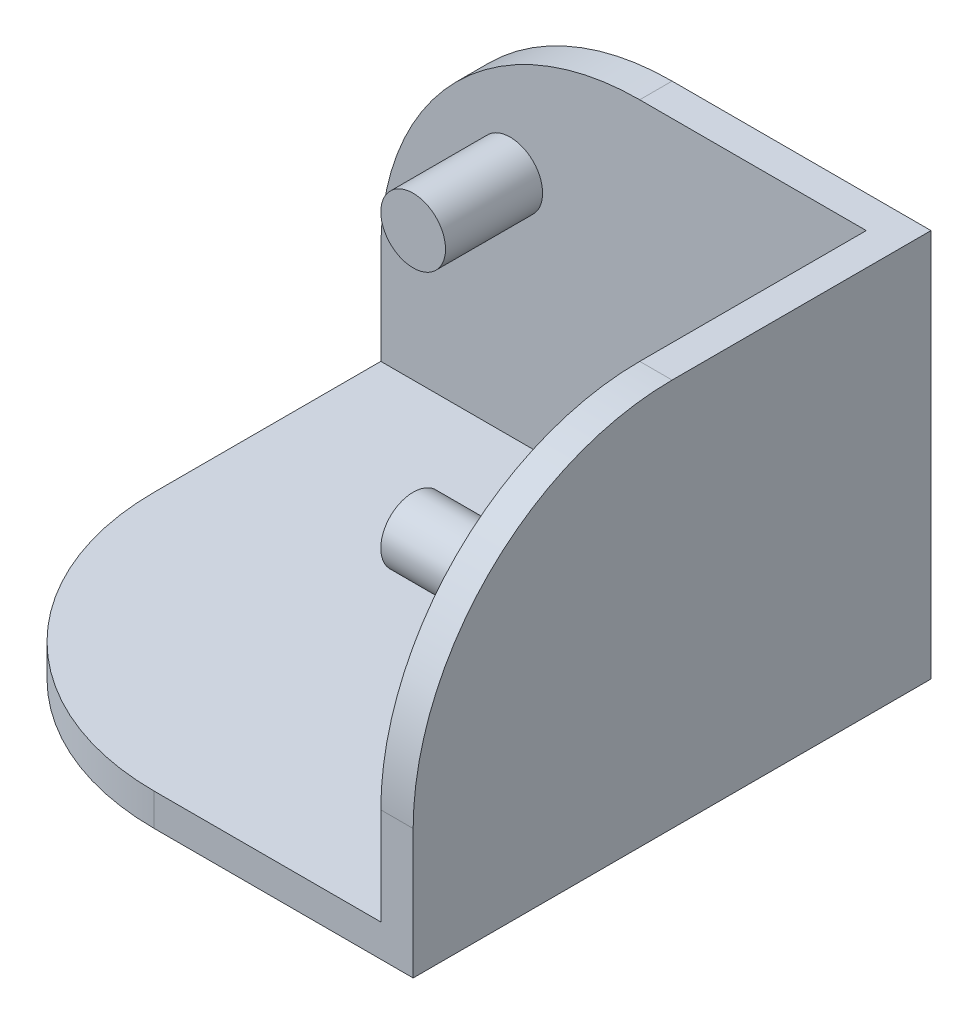
ISO-10303-21;
HEADER;
FILE_DESCRIPTION(('STEP AP214'),'2;1');
FILE_NAME('part.step','',(''),(''),'','','');
FILE_SCHEMA(('AUTOMOTIVE_DESIGN { 1 0 10303 214 1 1 1 1 }'));
ENDSEC;
DATA;
#1=APPLICATION_CONTEXT('core data for automotive mechanical design processes');
#2=APPLICATION_PROTOCOL_DEFINITION('international standard','automotive_design',2000,#1);
#3=PRODUCT_CONTEXT('',#1,'mechanical');
#4=PRODUCT('Part','Part','',(#3));
#5=PRODUCT_RELATED_PRODUCT_CATEGORY('part','',(#4));
#6=PRODUCT_DEFINITION_FORMATION('','',#4);
#7=PRODUCT_DEFINITION_CONTEXT('part definition',#1,'design');
#8=PRODUCT_DEFINITION('design','',#6,#7);
#9=PRODUCT_DEFINITION_SHAPE('','',#8);
#10=(LENGTH_UNIT() NAMED_UNIT(*) SI_UNIT(.MILLI.,.METRE.));
#11=(NAMED_UNIT(*) PLANE_ANGLE_UNIT() SI_UNIT($,.RADIAN.));
#12=(NAMED_UNIT(*) SI_UNIT($,.STERADIAN.) SOLID_ANGLE_UNIT());
#13=UNCERTAINTY_MEASURE_WITH_UNIT(LENGTH_MEASURE(1.E-05),#10,'distance_accuracy_value','');
#14=(GEOMETRIC_REPRESENTATION_CONTEXT(3) GLOBAL_UNCERTAINTY_ASSIGNED_CONTEXT((#13)) GLOBAL_UNIT_ASSIGNED_CONTEXT((#10,
#11,#12)) REPRESENTATION_CONTEXT('',''));
#15=CARTESIAN_POINT('',(0.,0.,0.));
#16=DIRECTION('',(0.,0.,1.));
#17=DIRECTION('',(1.,0.,0.));
#18=AXIS2_PLACEMENT_3D('',#15,#16,#17);
#19=CARTESIAN_POINT('',(40.,5.,-40.));
#20=DIRECTION('',(-1.,0.,0.));
#21=DIRECTION('',(0.,0.,1.));
#22=AXIS2_PLACEMENT_3D('',#19,#20,#21);
#23=PLANE('',#22);
#24=DIRECTION('',(0.,0.,1.));
#25=VECTOR('',#24,1.);
#26=CARTESIAN_POINT('',(40.,60.,-40.));
#27=LINE('',#26,#25);
#28=CARTESIAN_POINT('',(40.,60.,-40.));
#29=VERTEX_POINT('',#28);
#30=CARTESIAN_POINT('',(40.,60.,0.));
#31=VERTEX_POINT('',#30);
#32=EDGE_CURVE('E120',#29,#31,#27,.T.);
#33=ORIENTED_EDGE('',*,*,#32,.T.);
#34=CARTESIAN_POINT('',(40.,20.,0.));
#35=DIRECTION('',(-1.,0.,0.));
#36=DIRECTION('',(0.,0.,1.));
#37=AXIS2_PLACEMENT_3D('',#34,#35,#36);
#38=CIRCLE('',#37,40.);
#39=CARTESIAN_POINT('',(40.,20.,40.));
#40=VERTEX_POINT('',#39);
#41=EDGE_CURVE('E189',#31,#40,#38,.F.);
#42=ORIENTED_EDGE('',*,*,#41,.T.);
#43=DIRECTION('',(0.,-1.,0.));
#44=VECTOR('',#43,1.);
#45=CARTESIAN_POINT('',(40.,5.,40.));
#46=LINE('',#45,#44);
#47=CARTESIAN_POINT('',(40.,0.,40.));
#48=VERTEX_POINT('',#47);
#49=EDGE_CURVE('E157',#40,#48,#46,.T.);
#50=ORIENTED_EDGE('',*,*,#49,.T.);
#51=DIRECTION('',(0.,0.,-1.));
#52=VECTOR('',#51,1.);
#53=CARTESIAN_POINT('',(40.,0.,-40.));
#54=LINE('',#53,#52);
#55=CARTESIAN_POINT('',(40.,0.,-40.));
#56=VERTEX_POINT('',#55);
#57=EDGE_CURVE('E125',#48,#56,#54,.T.);
#58=ORIENTED_EDGE('',*,*,#57,.T.);
#59=DIRECTION('',(0.,-1.,0.));
#60=VECTOR('',#59,1.);
#61=CARTESIAN_POINT('',(40.,5.,-40.));
#62=LINE('',#61,#60);
#63=EDGE_CURVE('E116',#29,#56,#62,.T.);
#64=ORIENTED_EDGE('',*,*,#63,.F.);
#65=EDGE_LOOP('',(#33,#42,#50,#58,#64));
#66=FACE_BOUND('',#65,.T.);
#67=ADVANCED_FACE('F33',(#66),#23,.F.);
#68=CARTESIAN_POINT('',(-40.,5.,-40.));
#69=DIRECTION('',(0.,0.,1.));
#70=DIRECTION('',(1.,0.,0.));
#71=AXIS2_PLACEMENT_3D('',#68,#69,#70);
#72=PLANE('',#71);
#73=DIRECTION('',(0.,-1.,0.));
#74=VECTOR('',#73,1.);
#75=CARTESIAN_POINT('',(-40.,5.,-40.));
#76=LINE('',#75,#74);
#77=CARTESIAN_POINT('',(-40.,20.,-40.));
#78=VERTEX_POINT('',#77);
#79=CARTESIAN_POINT('',(-40.,0.,-40.));
#80=VERTEX_POINT('',#79);
#81=EDGE_CURVE('E127',#78,#80,#76,.T.);
#82=ORIENTED_EDGE('',*,*,#81,.F.);
#83=CARTESIAN_POINT('',(0.,20.,-40.));
#84=DIRECTION('',(0.,0.,1.));
#85=DIRECTION('',(1.,0.,0.));
#86=AXIS2_PLACEMENT_3D('',#83,#84,#85);
#87=CIRCLE('',#86,40.);
#88=CARTESIAN_POINT('',(0.,60.,-40.));
#89=VERTEX_POINT('',#88);
#90=EDGE_CURVE('E118',#78,#89,#87,.F.);
#91=ORIENTED_EDGE('',*,*,#90,.T.);
#92=DIRECTION('',(1.,0.,0.));
#93=VECTOR('',#92,1.);
#94=CARTESIAN_POINT('',(-40.,60.,-40.));
#95=LINE('',#94,#93);
#96=EDGE_CURVE('E111',#89,#29,#95,.T.);
#97=ORIENTED_EDGE('',*,*,#96,.T.);
#98=ORIENTED_EDGE('',*,*,#63,.T.);
#99=DIRECTION('',(-1.,0.,0.));
#100=VECTOR('',#99,1.);
#101=CARTESIAN_POINT('',(-40.,0.,-40.));
#102=LINE('',#101,#100);
#103=EDGE_CURVE('E159',#56,#80,#102,.T.);
#104=ORIENTED_EDGE('',*,*,#103,.T.);
#105=EDGE_LOOP('',(#82,#91,#97,#98,#104));
#106=FACE_BOUND('',#105,.T.);
#107=ADVANCED_FACE('F114',(#106),#72,.F.);
#108=CARTESIAN_POINT('',(-40.,5.,-40.));
#109=DIRECTION('',(1.,0.,0.));
#110=DIRECTION('',(0.,0.,-1.));
#111=AXIS2_PLACEMENT_3D('',#108,#109,#110);
#112=PLANE('',#111);
#113=DIRECTION('',(0.,0.,1.));
#114=VECTOR('',#113,1.);
#115=CARTESIAN_POINT('',(-40.,0.,-40.));
#116=LINE('',#115,#114);
#117=CARTESIAN_POINT('',(-40.,0.,0.));
#118=VERTEX_POINT('',#117);
#119=EDGE_CURVE('E161',#80,#118,#116,.T.);
#120=ORIENTED_EDGE('',*,*,#119,.T.);
#121=DIRECTION('',(0.,-1.,0.));
#122=VECTOR('',#121,1.);
#123=CARTESIAN_POINT('',(-40.,5.,0.));
#124=LINE('',#123,#122);
#125=CARTESIAN_POINT('',(-40.,5.,0.));
#126=VERTEX_POINT('',#125);
#127=EDGE_CURVE('E178',#118,#126,#124,.F.);
#128=ORIENTED_EDGE('',*,*,#127,.T.);
#129=DIRECTION('',(0.,0.,1.));
#130=VECTOR('',#129,1.);
#131=CARTESIAN_POINT('',(-40.,5.,-40.));
#132=LINE('',#131,#130);
#133=CARTESIAN_POINT('',(-40.,5.,-35.));
#134=VERTEX_POINT('',#133);
#135=EDGE_CURVE('E151',#134,#126,#132,.T.);
#136=ORIENTED_EDGE('',*,*,#135,.F.);
#137=DIRECTION('',(0.,-1.,0.));
#138=VECTOR('',#137,1.);
#139=CARTESIAN_POINT('',(-40.,60.,-35.));
#140=LINE('',#139,#138);
#141=CARTESIAN_POINT('',(-40.,20.,-35.));
#142=VERTEX_POINT('',#141);
#143=EDGE_CURVE('E146',#142,#134,#140,.T.);
#144=ORIENTED_EDGE('',*,*,#143,.F.);
#145=DIRECTION('',(0.,0.,-1.));
#146=VECTOR('',#145,1.);
#147=CARTESIAN_POINT('',(-40.,20.,-40.));
#148=LINE('',#147,#146);
#149=EDGE_CURVE('E175',#142,#78,#148,.T.);
#150=ORIENTED_EDGE('',*,*,#149,.T.);
#151=ORIENTED_EDGE('',*,*,#81,.T.);
#152=EDGE_LOOP('',(#120,#128,#136,#144,#150,#151));
#153=FACE_BOUND('',#152,.T.);
#154=ADVANCED_FACE('F214',(#153),#112,.F.);
#155=CARTESIAN_POINT('',(-40.,5.,40.));
#156=DIRECTION('',(0.,0.,-1.));
#157=DIRECTION('',(-1.,0.,0.));
#158=AXIS2_PLACEMENT_3D('',#155,#156,#157);
#159=PLANE('',#158);
#160=DIRECTION('',(1.,0.,0.));
#161=VECTOR('',#160,1.);
#162=CARTESIAN_POINT('',(-40.,5.,40.));
#163=LINE('',#162,#161);
#164=CARTESIAN_POINT('',(0.,5.,40.));
#165=VERTEX_POINT('',#164);
#166=CARTESIAN_POINT('',(35.,5.,40.));
#167=VERTEX_POINT('',#166);
#168=EDGE_CURVE('E154',#165,#167,#163,.T.);
#169=ORIENTED_EDGE('',*,*,#168,.F.);
#170=DIRECTION('',(0.,-1.,0.));
#171=VECTOR('',#170,1.);
#172=CARTESIAN_POINT('',(0.,5.,40.));
#173=LINE('',#172,#171);
#174=CARTESIAN_POINT('',(0.,0.,40.));
#175=VERTEX_POINT('',#174);
#176=EDGE_CURVE('E170',#165,#175,#173,.T.);
#177=ORIENTED_EDGE('',*,*,#176,.T.);
#178=DIRECTION('',(1.,0.,0.));
#179=VECTOR('',#178,1.);
#180=CARTESIAN_POINT('',(-40.,0.,40.));
#181=LINE('',#180,#179);
#182=EDGE_CURVE('E155',#175,#48,#181,.T.);
#183=ORIENTED_EDGE('',*,*,#182,.T.);
#184=ORIENTED_EDGE('',*,*,#49,.F.);
#185=DIRECTION('',(-1.,0.,0.));
#186=VECTOR('',#185,1.);
#187=CARTESIAN_POINT('',(-40.,20.,40.));
#188=LINE('',#187,#186);
#189=CARTESIAN_POINT('',(35.,20.,40.));
#190=VERTEX_POINT('',#189);
#191=EDGE_CURVE('E126',#40,#190,#188,.T.);
#192=ORIENTED_EDGE('',*,*,#191,.T.);
#193=DIRECTION('',(0.,-1.,0.));
#194=VECTOR('',#193,1.);
#195=CARTESIAN_POINT('',(35.,60.,40.));
#196=LINE('',#195,#194);
#197=EDGE_CURVE('E148',#190,#167,#196,.T.);
#198=ORIENTED_EDGE('',*,*,#197,.T.);
#199=EDGE_LOOP('',(#169,#177,#183,#184,#192,#198));
#200=FACE_BOUND('',#199,.T.);
#201=ADVANCED_FACE('F205',(#200),#159,.F.);
#202=CARTESIAN_POINT('',(0.,5.,0.));
#203=DIRECTION('',(0.,1.,0.));
#204=DIRECTION('',(0.,0.,1.));
#205=AXIS2_PLACEMENT_3D('',#202,#203,#204);
#206=PLANE('',#205);
#207=ORIENTED_EDGE('',*,*,#135,.T.);
#208=CARTESIAN_POINT('',(0.,5.,0.));
#209=DIRECTION('',(0.,1.,0.));
#210=DIRECTION('',(0.,0.,1.));
#211=AXIS2_PLACEMENT_3D('',#208,#209,#210);
#212=CIRCLE('',#211,40.);
#213=EDGE_CURVE('E180',#126,#165,#212,.T.);
#214=ORIENTED_EDGE('',*,*,#213,.T.);
#215=ORIENTED_EDGE('',*,*,#168,.T.);
#216=DIRECTION('',(0.,0.,1.));
#217=VECTOR('',#216,1.);
#218=CARTESIAN_POINT('',(35.,5.,-40.));
#219=LINE('',#218,#217);
#220=CARTESIAN_POINT('',(35.,5.,-35.));
#221=VERTEX_POINT('',#220);
#222=EDGE_CURVE('E138',#221,#167,#219,.T.);
#223=ORIENTED_EDGE('',*,*,#222,.F.);
#224=DIRECTION('',(1.,0.,0.));
#225=VECTOR('',#224,1.);
#226=CARTESIAN_POINT('',(-40.,5.,-35.));
#227=LINE('',#226,#225);
#228=EDGE_CURVE('E132',#134,#221,#227,.T.);
#229=ORIENTED_EDGE('',*,*,#228,.F.);
#230=EDGE_LOOP('',(#207,#214,#215,#223,#229));
#231=FACE_BOUND('',#230,.T.);
#232=ADVANCED_FACE('F226',(#231),#206,.T.);
#233=CARTESIAN_POINT('',(0.,0.,0.));
#234=DIRECTION('',(0.,1.,0.));
#235=DIRECTION('',(0.,0.,1.));
#236=AXIS2_PLACEMENT_3D('',#233,#234,#235);
#237=PLANE('',#236);
#238=ORIENTED_EDGE('',*,*,#182,.F.);
#239=CARTESIAN_POINT('',(0.,0.,0.));
#240=DIRECTION('',(0.,1.,0.));
#241=DIRECTION('',(0.,0.,1.));
#242=AXIS2_PLACEMENT_3D('',#239,#240,#241);
#243=CIRCLE('',#242,40.);
#244=EDGE_CURVE('E173',#175,#118,#243,.F.);
#245=ORIENTED_EDGE('',*,*,#244,.T.);
#246=ORIENTED_EDGE('',*,*,#119,.F.);
#247=ORIENTED_EDGE('',*,*,#103,.F.);
#248=ORIENTED_EDGE('',*,*,#57,.F.);
#249=EDGE_LOOP('',(#238,#245,#246,#247,#248));
#250=FACE_BOUND('',#249,.T.);
#251=ADVANCED_FACE('F199',(#250),#237,.F.);
#252=CARTESIAN_POINT('',(35.,60.,-40.));
#253=DIRECTION('',(1.,0.,0.));
#254=DIRECTION('',(0.,0.,-1.));
#255=AXIS2_PLACEMENT_3D('',#252,#253,#254);
#256=PLANE('',#255);
#257=CARTESIAN_POINT('',(35.,40.,20.));
#258=DIRECTION('',(1.,0.,0.));
#259=DIRECTION('',(0.,0.,-1.));
#260=AXIS2_PLACEMENT_3D('',#257,#258,#259);
#261=CIRCLE('',#260,5.);
#262=CARTESIAN_POINT('',(35.,40.,15.));
#263=VERTEX_POINT('',#262);
#264=EDGE_CURVE('E41',#263,#263,#261,.F.);
#265=ORIENTED_EDGE('',*,*,#264,.F.);
#266=EDGE_LOOP('',(#265));
#267=FACE_BOUND('',#266,.T.);
#268=ORIENTED_EDGE('',*,*,#197,.F.);
#269=CARTESIAN_POINT('',(35.,20.,0.));
#270=DIRECTION('',(1.,0.,0.));
#271=DIRECTION('',(0.,0.,-1.));
#272=AXIS2_PLACEMENT_3D('',#269,#270,#271);
#273=CIRCLE('',#272,40.);
#274=CARTESIAN_POINT('',(35.,60.,0.));
#275=VERTEX_POINT('',#274);
#276=EDGE_CURVE('E187',#190,#275,#273,.F.);
#277=ORIENTED_EDGE('',*,*,#276,.T.);
#278=DIRECTION('',(0.,0.,1.));
#279=VECTOR('',#278,1.);
#280=CARTESIAN_POINT('',(35.,60.,-40.));
#281=LINE('',#280,#279);
#282=CARTESIAN_POINT('',(35.,60.,-35.));
#283=VERTEX_POINT('',#282);
#284=EDGE_CURVE('E130',#283,#275,#281,.T.);
#285=ORIENTED_EDGE('',*,*,#284,.F.);
#286=DIRECTION('',(0.,-1.,0.));
#287=VECTOR('',#286,1.);
#288=CARTESIAN_POINT('',(35.,60.,-35.));
#289=LINE('',#288,#287);
#290=EDGE_CURVE('E137',#283,#221,#289,.T.);
#291=ORIENTED_EDGE('',*,*,#290,.T.);
#292=ORIENTED_EDGE('',*,*,#222,.T.);
#293=EDGE_LOOP('',(#268,#277,#285,#291,#292));
#294=FACE_BOUND('',#293,.T.);
#295=ADVANCED_FACE('F195',(#267,#294),#256,.F.);
#296=CARTESIAN_POINT('',(-40.,60.,-35.));
#297=DIRECTION('',(0.,0.,-1.));
#298=DIRECTION('',(-1.,0.,0.));
#299=AXIS2_PLACEMENT_3D('',#296,#297,#298);
#300=PLANE('',#299);
#301=CARTESIAN_POINT('',(-20.,40.,-35.));
#302=DIRECTION('',(0.,0.,-1.));
#303=DIRECTION('',(-1.,0.,0.));
#304=AXIS2_PLACEMENT_3D('',#301,#302,#303);
#305=CIRCLE('',#304,5.);
#306=CARTESIAN_POINT('',(-25.,40.,-35.));
#307=VERTEX_POINT('',#306);
#308=EDGE_CURVE('E11',#307,#307,#305,.F.);
#309=ORIENTED_EDGE('',*,*,#308,.F.);
#310=EDGE_LOOP('',(#309));
#311=FACE_BOUND('',#310,.T.);
#312=DIRECTION('',(1.,0.,0.));
#313=VECTOR('',#312,1.);
#314=CARTESIAN_POINT('',(-40.,60.,-35.));
#315=LINE('',#314,#313);
#316=CARTESIAN_POINT('',(0.,60.,-35.));
#317=VERTEX_POINT('',#316);
#318=EDGE_CURVE('E119',#317,#283,#315,.T.);
#319=ORIENTED_EDGE('',*,*,#318,.F.);
#320=CARTESIAN_POINT('',(0.,20.,-35.));
#321=DIRECTION('',(0.,0.,-1.));
#322=DIRECTION('',(-1.,0.,0.));
#323=AXIS2_PLACEMENT_3D('',#320,#321,#322);
#324=CIRCLE('',#323,40.);
#325=EDGE_CURVE('E185',#317,#142,#324,.F.);
#326=ORIENTED_EDGE('',*,*,#325,.T.);
#327=ORIENTED_EDGE('',*,*,#143,.T.);
#328=ORIENTED_EDGE('',*,*,#228,.T.);
#329=ORIENTED_EDGE('',*,*,#290,.F.);
#330=EDGE_LOOP('',(#319,#326,#327,#328,#329));
#331=FACE_BOUND('',#330,.T.);
#332=ADVANCED_FACE('F198',(#311,#331),#300,.F.);
#333=CARTESIAN_POINT('',(0.,60.,0.));
#334=DIRECTION('',(0.,-1.,0.));
#335=DIRECTION('',(-1.,0.,0.));
#336=AXIS2_PLACEMENT_3D('',#333,#334,#335);
#337=PLANE('',#336);
#338=ORIENTED_EDGE('',*,*,#96,.F.);
#339=DIRECTION('',(0.,0.,-1.));
#340=VECTOR('',#339,1.);
#341=CARTESIAN_POINT('',(0.,60.,0.));
#342=LINE('',#341,#340);
#343=EDGE_CURVE('E48',#89,#317,#342,.F.);
#344=ORIENTED_EDGE('',*,*,#343,.T.);
#345=ORIENTED_EDGE('',*,*,#318,.T.);
#346=ORIENTED_EDGE('',*,*,#284,.T.);
#347=DIRECTION('',(-1.,0.,0.));
#348=VECTOR('',#347,1.);
#349=CARTESIAN_POINT('',(0.,60.,0.));
#350=LINE('',#349,#348);
#351=EDGE_CURVE('E55',#275,#31,#350,.F.);
#352=ORIENTED_EDGE('',*,*,#351,.T.);
#353=ORIENTED_EDGE('',*,*,#32,.F.);
#354=EDGE_LOOP('',(#338,#344,#345,#346,#352,#353));
#355=FACE_BOUND('',#354,.T.);
#356=ADVANCED_FACE('F129',(#355),#337,.F.);
#357=CARTESIAN_POINT('',(0.,5.,0.));
#358=DIRECTION('',(0.,-1.,0.));
#359=DIRECTION('',(0.,0.,-1.));
#360=AXIS2_PLACEMENT_3D('',#357,#358,#359);
#361=CYLINDRICAL_SURFACE('',#360,40.);
#362=ORIENTED_EDGE('',*,*,#213,.F.);
#363=ORIENTED_EDGE('',*,*,#127,.F.);
#364=ORIENTED_EDGE('',*,*,#244,.F.);
#365=ORIENTED_EDGE('',*,*,#176,.F.);
#366=EDGE_LOOP('',(#362,#363,#364,#365));
#367=FACE_BOUND('',#366,.T.);
#368=ADVANCED_FACE('F229',(#367),#361,.T.);
#369=CARTESIAN_POINT('',(0.,20.,-40.));
#370=DIRECTION('',(0.,0.,-1.));
#371=DIRECTION('',(-1.,0.,0.));
#372=AXIS2_PLACEMENT_3D('',#369,#370,#371);
#373=CYLINDRICAL_SURFACE('',#372,40.);
#374=ORIENTED_EDGE('',*,*,#325,.F.);
#375=ORIENTED_EDGE('',*,*,#343,.F.);
#376=ORIENTED_EDGE('',*,*,#90,.F.);
#377=ORIENTED_EDGE('',*,*,#149,.F.);
#378=EDGE_LOOP('',(#374,#375,#376,#377));
#379=FACE_BOUND('',#378,.T.);
#380=ADVANCED_FACE('F221',(#379),#373,.T.);
#381=CARTESIAN_POINT('',(-40.,20.,0.));
#382=DIRECTION('',(-1.,0.,0.));
#383=DIRECTION('',(0.,0.,1.));
#384=AXIS2_PLACEMENT_3D('',#381,#382,#383);
#385=CYLINDRICAL_SURFACE('',#384,40.);
#386=ORIENTED_EDGE('',*,*,#41,.F.);
#387=ORIENTED_EDGE('',*,*,#351,.F.);
#388=ORIENTED_EDGE('',*,*,#276,.F.);
#389=ORIENTED_EDGE('',*,*,#191,.F.);
#390=EDGE_LOOP('',(#386,#387,#388,#389));
#391=FACE_BOUND('',#390,.T.);
#392=ADVANCED_FACE('F35',(#391),#385,.T.);
#393=CARTESIAN_POINT('',(20.,40.,20.));
#394=DIRECTION('',(1.,0.,0.));
#395=DIRECTION('',(0.,0.,-1.));
#396=AXIS2_PLACEMENT_3D('',#393,#394,#395);
#397=CYLINDRICAL_SURFACE('',#396,5.);
#398=CARTESIAN_POINT('',(20.,40.,20.));
#399=DIRECTION('',(-1.,0.,0.));
#400=DIRECTION('',(0.,0.,1.));
#401=AXIS2_PLACEMENT_3D('',#398,#399,#400);
#402=CIRCLE('',#401,5.);
#403=CARTESIAN_POINT('',(20.,40.,25.));
#404=VERTEX_POINT('',#403);
#405=EDGE_CURVE('E141',#404,#404,#402,.T.);
#406=ORIENTED_EDGE('',*,*,#405,.F.);
#407=EDGE_LOOP('',(#406));
#408=FACE_BOUND('',#407,.T.);
#409=ORIENTED_EDGE('',*,*,#264,.T.);
#410=EDGE_LOOP('',(#409));
#411=FACE_BOUND('',#410,.T.);
#412=ADVANCED_FACE('F193',(#408,#411),#397,.T.);
#413=CARTESIAN_POINT('',(20.,40.,20.));
#414=DIRECTION('',(-1.,0.,0.));
#415=DIRECTION('',(0.,0.,1.));
#416=AXIS2_PLACEMENT_3D('',#413,#414,#415);
#417=PLANE('',#416);
#418=ORIENTED_EDGE('',*,*,#405,.T.);
#419=EDGE_LOOP('',(#418));
#420=FACE_BOUND('',#419,.T.);
#421=ADVANCED_FACE('F257',(#420),#417,.T.);
#422=CARTESIAN_POINT('',(-20.,40.,-20.));
#423=DIRECTION('',(0.,0.,-1.));
#424=DIRECTION('',(-1.,0.,0.));
#425=AXIS2_PLACEMENT_3D('',#422,#423,#424);
#426=CYLINDRICAL_SURFACE('',#425,5.);
#427=CARTESIAN_POINT('',(-20.,40.,-20.));
#428=DIRECTION('',(0.,0.,1.));
#429=DIRECTION('',(1.,0.,0.));
#430=AXIS2_PLACEMENT_3D('',#427,#428,#429);
#431=CIRCLE('',#430,5.);
#432=CARTESIAN_POINT('',(-15.,40.,-20.));
#433=VERTEX_POINT('',#432);
#434=EDGE_CURVE('E273',#433,#433,#431,.T.);
#435=ORIENTED_EDGE('',*,*,#434,.F.);
#436=EDGE_LOOP('',(#435));
#437=FACE_BOUND('',#436,.T.);
#438=ORIENTED_EDGE('',*,*,#308,.T.);
#439=EDGE_LOOP('',(#438));
#440=FACE_BOUND('',#439,.T.);
#441=ADVANCED_FACE('F261',(#437,#440),#426,.T.);
#442=CARTESIAN_POINT('',(-20.,40.,-20.));
#443=DIRECTION('',(0.,0.,1.));
#444=DIRECTION('',(1.,0.,0.));
#445=AXIS2_PLACEMENT_3D('',#442,#443,#444);
#446=PLANE('',#445);
#447=ORIENTED_EDGE('',*,*,#434,.T.);
#448=EDGE_LOOP('',(#447));
#449=FACE_BOUND('',#448,.T.);
#450=ADVANCED_FACE('F265',(#449),#446,.T.);
#451=CLOSED_SHELL('',(#67,#107,#154,#201,#232,#251,#295,#332,#356,#368,#380,#392,#412,#421,#441,#450));
#452=MANIFOLD_SOLID_BREP('B2',#451);
#453=ADVANCED_BREP_SHAPE_REPRESENTATION('',(#18,#452),#14);
#454=SHAPE_DEFINITION_REPRESENTATION(#9,#453);
ENDSEC;
END-ISO-10303-21;
